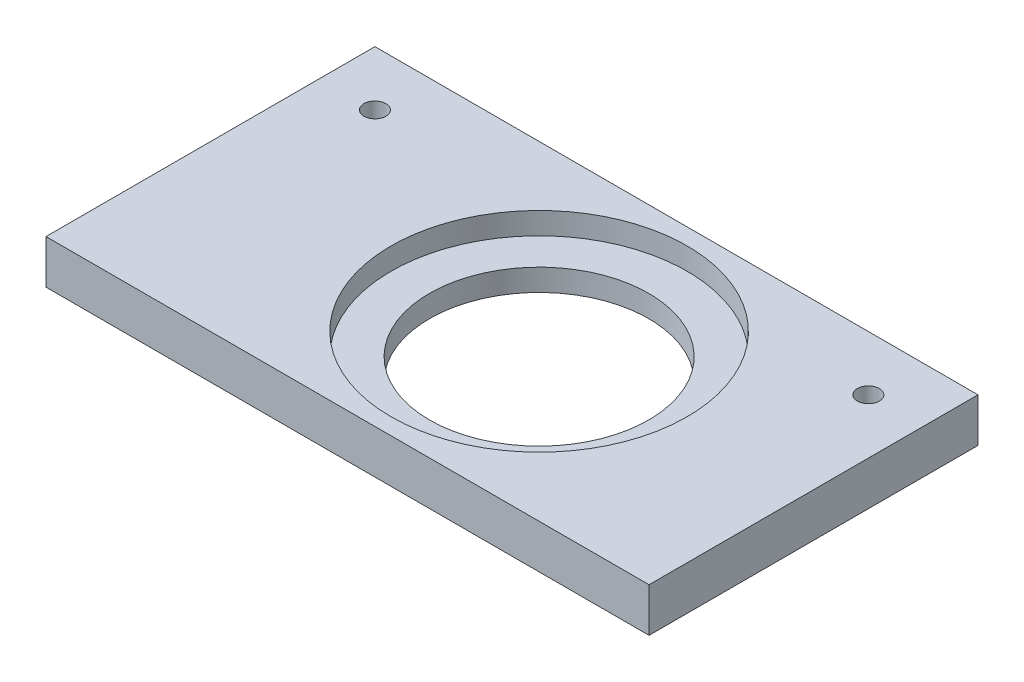
ISO-10303-21;
HEADER;
FILE_DESCRIPTION(('STEP AP214'),'2;1');
FILE_NAME('part.step','',(''),(''),'','','');
FILE_SCHEMA(('AUTOMOTIVE_DESIGN { 1 0 10303 214 1 1 1 1 }'));
ENDSEC;
DATA;
#1=APPLICATION_CONTEXT('core data for automotive mechanical design processes');
#2=APPLICATION_PROTOCOL_DEFINITION('international standard','automotive_design',2000,#1);
#3=PRODUCT_CONTEXT('',#1,'mechanical');
#4=PRODUCT('Part','Part','',(#3));
#5=PRODUCT_RELATED_PRODUCT_CATEGORY('part','',(#4));
#6=PRODUCT_DEFINITION_FORMATION('','',#4);
#7=PRODUCT_DEFINITION_CONTEXT('part definition',#1,'design');
#8=PRODUCT_DEFINITION('design','',#6,#7);
#9=PRODUCT_DEFINITION_SHAPE('','',#8);
#10=(LENGTH_UNIT() NAMED_UNIT(*) SI_UNIT(.MILLI.,.METRE.));
#11=(NAMED_UNIT(*) PLANE_ANGLE_UNIT() SI_UNIT($,.RADIAN.));
#12=(NAMED_UNIT(*) SI_UNIT($,.STERADIAN.) SOLID_ANGLE_UNIT());
#13=UNCERTAINTY_MEASURE_WITH_UNIT(LENGTH_MEASURE(1.E-05),#10,'distance_accuracy_value','');
#14=(GEOMETRIC_REPRESENTATION_CONTEXT(3) GLOBAL_UNCERTAINTY_ASSIGNED_CONTEXT((#13)) GLOBAL_UNIT_ASSIGNED_CONTEXT((#10,
#11,#12)) REPRESENTATION_CONTEXT('',''));
#15=CARTESIAN_POINT('',(0.,0.,0.));
#16=DIRECTION('',(0.,0.,1.));
#17=DIRECTION('',(1.,0.,0.));
#18=AXIS2_PLACEMENT_3D('',#15,#16,#17);
#19=CARTESIAN_POINT('',(0.,0.,0.));
#20=DIRECTION('',(0.,1.,0.));
#21=DIRECTION('',(0.,0.,1.));
#22=AXIS2_PLACEMENT_3D('',#19,#20,#21);
#23=CYLINDRICAL_SURFACE('',#22,50.);
#24=CARTESIAN_POINT('',(0.,0.,0.));
#25=DIRECTION('',(0.,1.,0.));
#26=DIRECTION('',(0.,0.,1.));
#27=AXIS2_PLACEMENT_3D('',#24,#25,#26);
#28=CIRCLE('',#27,50.);
#29=CARTESIAN_POINT('',(0.,0.,50.));
#30=VERTEX_POINT('',#29);
#31=EDGE_CURVE('E247',#30,#30,#28,.T.);
#32=ORIENTED_EDGE('',*,*,#31,.F.);
#33=EDGE_LOOP('',(#32));
#34=FACE_BOUND('',#33,.T.);
#35=CARTESIAN_POINT('',(0.,10.,0.));
#36=DIRECTION('',(0.,1.,0.));
#37=DIRECTION('',(0.,0.,1.));
#38=AXIS2_PLACEMENT_3D('',#35,#36,#37);
#39=CIRCLE('',#38,50.);
#40=CARTESIAN_POINT('',(0.,10.,50.));
#41=VERTEX_POINT('',#40);
#42=EDGE_CURVE('E46',#41,#41,#39,.F.);
#43=ORIENTED_EDGE('',*,*,#42,.F.);
#44=EDGE_LOOP('',(#43));
#45=FACE_BOUND('',#44,.T.);
#46=ADVANCED_FACE('F42',(#34,#45),#23,.F.);
#47=CARTESIAN_POINT('',(0.,20.,0.));
#48=DIRECTION('',(0.,-1.,0.));
#49=DIRECTION('',(0.,0.,-1.));
#50=AXIS2_PLACEMENT_3D('',#47,#48,#49);
#51=PLANE('',#50);
#52=CARTESIAN_POINT('',(100.14,20.,-50.));
#53=DIRECTION('',(0.,1.,0.));
#54=DIRECTION('',(0.,0.,1.));
#55=AXIS2_PLACEMENT_3D('',#52,#53,#54);
#56=CIRCLE('',#55,4.99999999999999);
#57=CARTESIAN_POINT('',(100.14,20.,-45.));
#58=VERTEX_POINT('',#57);
#59=EDGE_CURVE('E234',#58,#58,#56,.T.);
#60=ORIENTED_EDGE('',*,*,#59,.F.);
#61=EDGE_LOOP('',(#60));
#62=FACE_BOUND('',#61,.T.);
#63=CARTESIAN_POINT('',(-124.86,20.,-50.));
#64=DIRECTION('',(0.,1.,0.));
#65=DIRECTION('',(0.,0.,-1.));
#66=AXIS2_PLACEMENT_3D('',#63,#64,#65);
#67=CIRCLE('',#66,5.00000000000002);
#68=CARTESIAN_POINT('',(-124.86,20.,-55.));
#69=VERTEX_POINT('',#68);
#70=EDGE_CURVE('E200',#69,#69,#67,.T.);
#71=ORIENTED_EDGE('',*,*,#70,.F.);
#72=EDGE_LOOP('',(#71));
#73=FACE_BOUND('',#72,.T.);
#74=CARTESIAN_POINT('',(0.,20.,0.));
#75=DIRECTION('',(0.,1.,0.));
#76=DIRECTION('',(0.,0.,1.));
#77=AXIS2_PLACEMENT_3D('',#74,#75,#76);
#78=CIRCLE('',#77,67.5);
#79=CARTESIAN_POINT('',(0.,20.,67.5));
#80=VERTEX_POINT('',#79);
#81=EDGE_CURVE('E233',#80,#80,#78,.T.);
#82=ORIENTED_EDGE('',*,*,#81,.F.);
#83=EDGE_LOOP('',(#82));
#84=FACE_BOUND('',#83,.T.);
#85=DIRECTION('',(0.,0.,-1.));
#86=VECTOR('',#85,1.);
#87=CARTESIAN_POINT('',(125.14,20.,75.));
#88=LINE('',#87,#86);
#89=CARTESIAN_POINT('',(125.14,20.,75.));
#90=VERTEX_POINT('',#89);
#91=CARTESIAN_POINT('',(125.14,20.,-75.));
#92=VERTEX_POINT('',#91);
#93=EDGE_CURVE('E251',#90,#92,#88,.T.);
#94=ORIENTED_EDGE('',*,*,#93,.T.);
#95=DIRECTION('',(-1.,0.,0.));
#96=VECTOR('',#95,1.);
#97=CARTESIAN_POINT('',(-149.86,20.,-75.));
#98=LINE('',#97,#96);
#99=CARTESIAN_POINT('',(-149.86,20.,-75.));
#100=VERTEX_POINT('',#99);
#101=EDGE_CURVE('E254',#92,#100,#98,.T.);
#102=ORIENTED_EDGE('',*,*,#101,.T.);
#103=DIRECTION('',(0.,0.,1.));
#104=VECTOR('',#103,1.);
#105=CARTESIAN_POINT('',(-149.86,20.,75.));
#106=LINE('',#105,#104);
#107=CARTESIAN_POINT('',(-149.86,20.,75.));
#108=VERTEX_POINT('',#107);
#109=EDGE_CURVE('E257',#100,#108,#106,.T.);
#110=ORIENTED_EDGE('',*,*,#109,.T.);
#111=DIRECTION('',(1.,0.,0.));
#112=VECTOR('',#111,1.);
#113=CARTESIAN_POINT('',(-149.86,20.,75.));
#114=LINE('',#113,#112);
#115=EDGE_CURVE('E259',#108,#90,#114,.T.);
#116=ORIENTED_EDGE('',*,*,#115,.T.);
#117=EDGE_LOOP('',(#94,#102,#110,#116));
#118=FACE_BOUND('',#117,.T.);
#119=ADVANCED_FACE('F300',(#62,#73,#84,#118),#51,.F.);
#120=CARTESIAN_POINT('',(0.,0.,0.));
#121=DIRECTION('',(0.,-1.,0.));
#122=DIRECTION('',(0.,0.,-1.));
#123=AXIS2_PLACEMENT_3D('',#120,#121,#122);
#124=PLANE('',#123);
#125=DIRECTION('',(0.,0.,-1.));
#126=VECTOR('',#125,1.);
#127=CARTESIAN_POINT('',(-99.86,0.,-75.));
#128=LINE('',#127,#126);
#129=CARTESIAN_POINT('',(-99.86,0.,-68.52));
#130=VERTEX_POINT('',#129);
#131=CARTESIAN_POINT('',(-99.86,0.,-75.));
#132=VERTEX_POINT('',#131);
#133=EDGE_CURVE('E190',#130,#132,#128,.T.);
#134=ORIENTED_EDGE('',*,*,#133,.F.);
#135=DIRECTION('',(-1.,0.,0.));
#136=VECTOR('',#135,1.);
#137=CARTESIAN_POINT('',(-99.86,0.,-68.52));
#138=LINE('',#137,#136);
#139=CARTESIAN_POINT('',(-80.81,0.,-68.52));
#140=VERTEX_POINT('',#139);
#141=EDGE_CURVE('E182',#140,#130,#138,.T.);
#142=ORIENTED_EDGE('',*,*,#141,.F.);
#143=DIRECTION('',(0.,0.,1.));
#144=VECTOR('',#143,1.);
#145=CARTESIAN_POINT('',(-80.81,0.,-75.));
#146=LINE('',#145,#144);
#147=CARTESIAN_POINT('',(-80.81,0.,-75.));
#148=VERTEX_POINT('',#147);
#149=EDGE_CURVE('E192',#148,#140,#146,.T.);
#150=ORIENTED_EDGE('',*,*,#149,.F.);
#151=DIRECTION('',(-1.,0.,0.));
#152=VECTOR('',#151,1.);
#153=CARTESIAN_POINT('',(-149.86,0.,-75.));
#154=LINE('',#153,#152);
#155=CARTESIAN_POINT('',(56.09,0.,-75.));
#156=VERTEX_POINT('',#155);
#157=EDGE_CURVE('E269',#156,#148,#154,.T.);
#158=ORIENTED_EDGE('',*,*,#157,.F.);
#159=DIRECTION('',(0.,0.,-1.));
#160=VECTOR('',#159,1.);
#161=CARTESIAN_POINT('',(56.09,0.,-75.));
#162=LINE('',#161,#160);
#163=CARTESIAN_POINT('',(56.09,0.,-68.52));
#164=VERTEX_POINT('',#163);
#165=EDGE_CURVE('E193',#164,#156,#162,.T.);
#166=ORIENTED_EDGE('',*,*,#165,.F.);
#167=DIRECTION('',(-1.,0.,0.));
#168=VECTOR('',#167,1.);
#169=CARTESIAN_POINT('',(56.09,0.,-68.52));
#170=LINE('',#169,#168);
#171=CARTESIAN_POINT('',(75.14,0.,-68.52));
#172=VERTEX_POINT('',#171);
#173=EDGE_CURVE('E216',#172,#164,#170,.T.);
#174=ORIENTED_EDGE('',*,*,#173,.F.);
#175=DIRECTION('',(0.,0.,1.));
#176=VECTOR('',#175,1.);
#177=CARTESIAN_POINT('',(75.14,0.,-75.));
#178=LINE('',#177,#176);
#179=CARTESIAN_POINT('',(75.14,0.,-75.));
#180=VERTEX_POINT('',#179);
#181=EDGE_CURVE('E219',#180,#172,#178,.T.);
#182=ORIENTED_EDGE('',*,*,#181,.F.);
#183=CARTESIAN_POINT('',(125.14,0.,-75.));
#184=VERTEX_POINT('',#183);
#185=EDGE_CURVE('E265',#184,#180,#154,.T.);
#186=ORIENTED_EDGE('',*,*,#185,.F.);
#187=DIRECTION('',(0.,0.,-1.));
#188=VECTOR('',#187,1.);
#189=CARTESIAN_POINT('',(125.14,0.,75.));
#190=LINE('',#189,#188);
#191=CARTESIAN_POINT('',(125.14,0.,75.));
#192=VERTEX_POINT('',#191);
#193=EDGE_CURVE('E250',#192,#184,#190,.T.);
#194=ORIENTED_EDGE('',*,*,#193,.F.);
#195=DIRECTION('',(1.,0.,0.));
#196=VECTOR('',#195,1.);
#197=CARTESIAN_POINT('',(-149.86,0.,75.));
#198=LINE('',#197,#196);
#199=CARTESIAN_POINT('',(-149.86,0.,75.));
#200=VERTEX_POINT('',#199);
#201=EDGE_CURVE('E255',#200,#192,#198,.T.);
#202=ORIENTED_EDGE('',*,*,#201,.F.);
#203=DIRECTION('',(0.,0.,1.));
#204=VECTOR('',#203,1.);
#205=CARTESIAN_POINT('',(-149.86,0.,75.));
#206=LINE('',#205,#204);
#207=CARTESIAN_POINT('',(-149.86,0.,-75.));
#208=VERTEX_POINT('',#207);
#209=EDGE_CURVE('E268',#208,#200,#206,.T.);
#210=ORIENTED_EDGE('',*,*,#209,.F.);
#211=EDGE_CURVE('E264',#132,#208,#154,.T.);
#212=ORIENTED_EDGE('',*,*,#211,.F.);
#213=EDGE_LOOP('',(#134,#142,#150,#158,#166,#174,#182,#186,#194,#202,#210,#212));
#214=FACE_BOUND('',#213,.T.);
#215=CARTESIAN_POINT('',(100.14,0.,-50.));
#216=DIRECTION('',(0.,1.,0.));
#217=DIRECTION('',(0.,0.,1.));
#218=AXIS2_PLACEMENT_3D('',#215,#216,#217);
#219=CIRCLE('',#218,4.99999999999999);
#220=CARTESIAN_POINT('',(100.14,0.,-45.));
#221=VERTEX_POINT('',#220);
#222=EDGE_CURVE('E230',#221,#221,#219,.T.);
#223=ORIENTED_EDGE('',*,*,#222,.T.);
#224=EDGE_LOOP('',(#223));
#225=FACE_BOUND('',#224,.T.);
#226=CARTESIAN_POINT('',(-124.86,0.,-50.));
#227=DIRECTION('',(0.,1.,0.));
#228=DIRECTION('',(0.,0.,-1.));
#229=AXIS2_PLACEMENT_3D('',#226,#227,#228);
#230=CIRCLE('',#229,5.00000000000002);
#231=CARTESIAN_POINT('',(-124.86,0.,-55.));
#232=VERTEX_POINT('',#231);
#233=EDGE_CURVE('E237',#232,#232,#230,.T.);
#234=ORIENTED_EDGE('',*,*,#233,.T.);
#235=EDGE_LOOP('',(#234));
#236=FACE_BOUND('',#235,.T.);
#237=ORIENTED_EDGE('',*,*,#31,.T.);
#238=EDGE_LOOP('',(#237));
#239=FACE_BOUND('',#238,.T.);
#240=ADVANCED_FACE('F289',(#214,#225,#236,#239),#124,.T.);
#241=CARTESIAN_POINT('',(125.14,20.,75.));
#242=DIRECTION('',(-1.,0.,0.));
#243=DIRECTION('',(0.,0.,1.));
#244=AXIS2_PLACEMENT_3D('',#241,#242,#243);
#245=PLANE('',#244);
#246=ORIENTED_EDGE('',*,*,#193,.T.);
#247=DIRECTION('',(0.,-1.,0.));
#248=VECTOR('',#247,1.);
#249=CARTESIAN_POINT('',(125.14,20.,-75.));
#250=LINE('',#249,#248);
#251=EDGE_CURVE('E11',#92,#184,#250,.T.);
#252=ORIENTED_EDGE('',*,*,#251,.F.);
#253=ORIENTED_EDGE('',*,*,#93,.F.);
#254=DIRECTION('',(0.,-1.,0.));
#255=VECTOR('',#254,1.);
#256=CARTESIAN_POINT('',(125.14,20.,75.));
#257=LINE('',#256,#255);
#258=EDGE_CURVE('E261',#90,#192,#257,.T.);
#259=ORIENTED_EDGE('',*,*,#258,.T.);
#260=EDGE_LOOP('',(#246,#252,#253,#259));
#261=FACE_BOUND('',#260,.T.);
#262=ADVANCED_FACE('F44',(#261),#245,.F.);
#263=CARTESIAN_POINT('',(-149.86,20.,-75.));
#264=DIRECTION('',(0.,0.,1.));
#265=DIRECTION('',(1.,0.,0.));
#266=AXIS2_PLACEMENT_3D('',#263,#264,#265);
#267=PLANE('',#266);
#268=DIRECTION('',(1.,0.,0.));
#269=VECTOR('',#268,1.);
#270=CARTESIAN_POINT('',(-99.86,0.64,-75.));
#271=LINE('',#270,#269);
#272=CARTESIAN_POINT('',(-99.86,0.640000000000002,-75.));
#273=VERTEX_POINT('',#272);
#274=CARTESIAN_POINT('',(-80.81,0.64,-75.));
#275=VERTEX_POINT('',#274);
#276=EDGE_CURVE('E181',#273,#275,#271,.T.);
#277=ORIENTED_EDGE('',*,*,#276,.F.);
#278=DIRECTION('',(0.,-1.,0.));
#279=VECTOR('',#278,1.);
#280=CARTESIAN_POINT('',(-99.86,0.64,-75.));
#281=LINE('',#280,#279);
#282=EDGE_CURVE('E189',#273,#132,#281,.T.);
#283=ORIENTED_EDGE('',*,*,#282,.T.);
#284=ORIENTED_EDGE('',*,*,#211,.T.);
#285=DIRECTION('',(0.,-1.,0.));
#286=VECTOR('',#285,1.);
#287=CARTESIAN_POINT('',(-149.86,20.,-75.));
#288=LINE('',#287,#286);
#289=EDGE_CURVE('E51',#100,#208,#288,.T.);
#290=ORIENTED_EDGE('',*,*,#289,.F.);
#291=ORIENTED_EDGE('',*,*,#101,.F.);
#292=ORIENTED_EDGE('',*,*,#251,.T.);
#293=ORIENTED_EDGE('',*,*,#185,.T.);
#294=DIRECTION('',(0.,-1.,0.));
#295=VECTOR('',#294,1.);
#296=CARTESIAN_POINT('',(75.14,0.64,-75.));
#297=LINE('',#296,#295);
#298=CARTESIAN_POINT('',(75.14,0.64,-75.));
#299=VERTEX_POINT('',#298);
#300=EDGE_CURVE('E211',#299,#180,#297,.T.);
#301=ORIENTED_EDGE('',*,*,#300,.F.);
#302=DIRECTION('',(1.,0.,0.));
#303=VECTOR('',#302,1.);
#304=CARTESIAN_POINT('',(56.09,0.64,-75.));
#305=LINE('',#304,#303);
#306=CARTESIAN_POINT('',(56.09,0.640000000000002,-75.));
#307=VERTEX_POINT('',#306);
#308=EDGE_CURVE('E227',#307,#299,#305,.T.);
#309=ORIENTED_EDGE('',*,*,#308,.F.);
#310=DIRECTION('',(0.,-1.,0.));
#311=VECTOR('',#310,1.);
#312=CARTESIAN_POINT('',(56.09,0.64,-75.));
#313=LINE('',#312,#311);
#314=EDGE_CURVE('E207',#307,#156,#313,.T.);
#315=ORIENTED_EDGE('',*,*,#314,.T.);
#316=ORIENTED_EDGE('',*,*,#157,.T.);
#317=DIRECTION('',(0.,-1.,0.));
#318=VECTOR('',#317,1.);
#319=CARTESIAN_POINT('',(-80.81,0.64,-75.));
#320=LINE('',#319,#318);
#321=EDGE_CURVE('E203',#275,#148,#320,.T.);
#322=ORIENTED_EDGE('',*,*,#321,.F.);
#323=EDGE_LOOP('',(#277,#283,#284,#290,#291,#292,#293,#301,#309,#315,#316,#322));
#324=FACE_BOUND('',#323,.T.);
#325=ADVANCED_FACE('F302',(#324),#267,.F.);
#326=CARTESIAN_POINT('',(-149.86,20.,75.));
#327=DIRECTION('',(1.,0.,0.));
#328=DIRECTION('',(0.,0.,-1.));
#329=AXIS2_PLACEMENT_3D('',#326,#327,#328);
#330=PLANE('',#329);
#331=ORIENTED_EDGE('',*,*,#209,.T.);
#332=DIRECTION('',(0.,-1.,0.));
#333=VECTOR('',#332,1.);
#334=CARTESIAN_POINT('',(-149.86,20.,75.));
#335=LINE('',#334,#333);
#336=EDGE_CURVE('E274',#108,#200,#335,.T.);
#337=ORIENTED_EDGE('',*,*,#336,.F.);
#338=ORIENTED_EDGE('',*,*,#109,.F.);
#339=ORIENTED_EDGE('',*,*,#289,.T.);
#340=EDGE_LOOP('',(#331,#337,#338,#339));
#341=FACE_BOUND('',#340,.T.);
#342=ADVANCED_FACE('F282',(#341),#330,.F.);
#343=CARTESIAN_POINT('',(-149.86,20.,75.));
#344=DIRECTION('',(0.,0.,-1.));
#345=DIRECTION('',(-1.,0.,0.));
#346=AXIS2_PLACEMENT_3D('',#343,#344,#345);
#347=PLANE('',#346);
#348=ORIENTED_EDGE('',*,*,#201,.T.);
#349=ORIENTED_EDGE('',*,*,#258,.F.);
#350=ORIENTED_EDGE('',*,*,#115,.F.);
#351=ORIENTED_EDGE('',*,*,#336,.T.);
#352=EDGE_LOOP('',(#348,#349,#350,#351));
#353=FACE_BOUND('',#352,.T.);
#354=ADVANCED_FACE('F294',(#353),#347,.F.);
#355=CARTESIAN_POINT('',(0.,10.,0.));
#356=DIRECTION('',(0.,1.,0.));
#357=DIRECTION('',(0.,0.,1.));
#358=AXIS2_PLACEMENT_3D('',#355,#356,#357);
#359=PLANE('',#358);
#360=CARTESIAN_POINT('',(0.,10.,0.));
#361=DIRECTION('',(0.,1.,0.));
#362=DIRECTION('',(0.,0.,1.));
#363=AXIS2_PLACEMENT_3D('',#360,#361,#362);
#364=CIRCLE('',#363,67.5);
#365=CARTESIAN_POINT('',(0.,10.,67.5));
#366=VERTEX_POINT('',#365);
#367=EDGE_CURVE('E242',#366,#366,#364,.T.);
#368=ORIENTED_EDGE('',*,*,#367,.T.);
#369=EDGE_LOOP('',(#368));
#370=FACE_BOUND('',#369,.T.);
#371=ORIENTED_EDGE('',*,*,#42,.T.);
#372=EDGE_LOOP('',(#371));
#373=FACE_BOUND('',#372,.T.);
#374=ADVANCED_FACE('F359',(#370,#373),#359,.T.);
#375=CARTESIAN_POINT('',(0.,10.,0.));
#376=DIRECTION('',(0.,1.,0.));
#377=DIRECTION('',(0.,0.,1.));
#378=AXIS2_PLACEMENT_3D('',#375,#376,#377);
#379=CYLINDRICAL_SURFACE('',#378,67.5);
#380=ORIENTED_EDGE('',*,*,#367,.F.);
#381=EDGE_LOOP('',(#380));
#382=FACE_BOUND('',#381,.T.);
#383=ORIENTED_EDGE('',*,*,#81,.T.);
#384=EDGE_LOOP('',(#383));
#385=FACE_BOUND('',#384,.T.);
#386=ADVANCED_FACE('F352',(#382,#385),#379,.F.);
#387=CARTESIAN_POINT('',(-124.86,0.,-50.));
#388=DIRECTION('',(0.,1.,0.));
#389=DIRECTION('',(0.,0.,1.));
#390=AXIS2_PLACEMENT_3D('',#387,#388,#389);
#391=CYLINDRICAL_SURFACE('',#390,5.00000000000002);
#392=ORIENTED_EDGE('',*,*,#233,.F.);
#393=EDGE_LOOP('',(#392));
#394=FACE_BOUND('',#393,.T.);
#395=ORIENTED_EDGE('',*,*,#70,.T.);
#396=EDGE_LOOP('',(#395));
#397=FACE_BOUND('',#396,.T.);
#398=ADVANCED_FACE('F396',(#394,#397),#391,.F.);
#399=CARTESIAN_POINT('',(100.14,0.,-50.));
#400=DIRECTION('',(0.,1.,0.));
#401=DIRECTION('',(0.,0.,1.));
#402=AXIS2_PLACEMENT_3D('',#399,#400,#401);
#403=CYLINDRICAL_SURFACE('',#402,4.99999999999999);
#404=ORIENTED_EDGE('',*,*,#222,.F.);
#405=EDGE_LOOP('',(#404));
#406=FACE_BOUND('',#405,.T.);
#407=ORIENTED_EDGE('',*,*,#59,.T.);
#408=EDGE_LOOP('',(#407));
#409=FACE_BOUND('',#408,.T.);
#410=ADVANCED_FACE('F404',(#406,#409),#403,.F.);
#411=CARTESIAN_POINT('',(56.09,0.64,-75.));
#412=DIRECTION('',(-1.,0.,0.));
#413=DIRECTION('',(0.,0.,1.));
#414=AXIS2_PLACEMENT_3D('',#411,#412,#413);
#415=PLANE('',#414);
#416=ORIENTED_EDGE('',*,*,#165,.T.);
#417=ORIENTED_EDGE('',*,*,#314,.F.);
#418=DIRECTION('',(0.,0.,-1.));
#419=VECTOR('',#418,1.);
#420=CARTESIAN_POINT('',(56.09,0.64,-75.));
#421=LINE('',#420,#419);
#422=CARTESIAN_POINT('',(56.09,0.64,-68.52));
#423=VERTEX_POINT('',#422);
#424=EDGE_CURVE('E66',#423,#307,#421,.T.);
#425=ORIENTED_EDGE('',*,*,#424,.F.);
#426=DIRECTION('',(0.,-1.,0.));
#427=VECTOR('',#426,1.);
#428=CARTESIAN_POINT('',(56.09,0.64,-68.52));
#429=LINE('',#428,#427);
#430=EDGE_CURVE('E179',#423,#164,#429,.T.);
#431=ORIENTED_EDGE('',*,*,#430,.T.);
#432=EDGE_LOOP('',(#416,#417,#425,#431));
#433=FACE_BOUND('',#432,.T.);
#434=ADVANCED_FACE('F412',(#433),#415,.F.);
#435=CARTESIAN_POINT('',(56.09,0.64,-68.52));
#436=DIRECTION('',(0.,0.,1.));
#437=DIRECTION('',(1.,0.,0.));
#438=AXIS2_PLACEMENT_3D('',#435,#436,#437);
#439=PLANE('',#438);
#440=ORIENTED_EDGE('',*,*,#173,.T.);
#441=ORIENTED_EDGE('',*,*,#430,.F.);
#442=DIRECTION('',(-1.,0.,0.));
#443=VECTOR('',#442,1.);
#444=CARTESIAN_POINT('',(56.09,0.64,-68.52));
#445=LINE('',#444,#443);
#446=CARTESIAN_POINT('',(75.14,0.64,-68.52));
#447=VERTEX_POINT('',#446);
#448=EDGE_CURVE('E210',#447,#423,#445,.T.);
#449=ORIENTED_EDGE('',*,*,#448,.F.);
#450=DIRECTION('',(0.,-1.,0.));
#451=VECTOR('',#450,1.);
#452=CARTESIAN_POINT('',(75.14,0.64,-68.52));
#453=LINE('',#452,#451);
#454=EDGE_CURVE('E213',#447,#172,#453,.T.);
#455=ORIENTED_EDGE('',*,*,#454,.T.);
#456=EDGE_LOOP('',(#440,#441,#449,#455));
#457=FACE_BOUND('',#456,.T.);
#458=ADVANCED_FACE('F419',(#457),#439,.F.);
#459=CARTESIAN_POINT('',(75.14,0.64,-75.));
#460=DIRECTION('',(1.,0.,0.));
#461=DIRECTION('',(0.,0.,-1.));
#462=AXIS2_PLACEMENT_3D('',#459,#460,#461);
#463=PLANE('',#462);
#464=ORIENTED_EDGE('',*,*,#181,.T.);
#465=ORIENTED_EDGE('',*,*,#454,.F.);
#466=DIRECTION('',(0.,0.,1.));
#467=VECTOR('',#466,1.);
#468=CARTESIAN_POINT('',(75.14,0.64,-75.));
#469=LINE('',#468,#467);
#470=EDGE_CURVE('E224',#299,#447,#469,.T.);
#471=ORIENTED_EDGE('',*,*,#470,.F.);
#472=ORIENTED_EDGE('',*,*,#300,.T.);
#473=EDGE_LOOP('',(#464,#465,#471,#472));
#474=FACE_BOUND('',#473,.T.);
#475=ADVANCED_FACE('F309',(#474),#463,.F.);
#476=CARTESIAN_POINT('',(0.,0.64,0.));
#477=DIRECTION('',(0.,1.,0.));
#478=DIRECTION('',(0.,0.,1.));
#479=AXIS2_PLACEMENT_3D('',#476,#477,#478);
#480=PLANE('',#479);
#481=CARTESIAN_POINT('',(71.18,0.639999999999999,-71.76));
#482=DIRECTION('',(0.,-1.,0.));
#483=DIRECTION('',(0.,0.,-1.));
#484=AXIS2_PLACEMENT_3D('',#481,#482,#483);
#485=CIRCLE('',#484,1.3);
#486=CARTESIAN_POINT('',(71.18,0.639999999999999,-73.06));
#487=VERTEX_POINT('',#486);
#488=EDGE_CURVE('E167',#487,#487,#485,.T.);
#489=ORIENTED_EDGE('',*,*,#488,.F.);
#490=EDGE_LOOP('',(#489));
#491=FACE_BOUND('',#490,.T.);
#492=CARTESIAN_POINT('',(60.2096162601313,0.639999999999999,-71.76));
#493=DIRECTION('',(0.,-1.,0.));
#494=DIRECTION('',(0.,0.,-1.));
#495=AXIS2_PLACEMENT_3D('',#492,#493,#494);
#496=CIRCLE('',#495,1.29999999999999);
#497=CARTESIAN_POINT('',(60.2096162601313,0.639999999999999,-73.06));
#498=VERTEX_POINT('',#497);
#499=EDGE_CURVE('E173',#498,#498,#496,.T.);
#500=ORIENTED_EDGE('',*,*,#499,.F.);
#501=EDGE_LOOP('',(#500));
#502=FACE_BOUND('',#501,.T.);
#503=ORIENTED_EDGE('',*,*,#424,.T.);
#504=ORIENTED_EDGE('',*,*,#308,.T.);
#505=ORIENTED_EDGE('',*,*,#470,.T.);
#506=ORIENTED_EDGE('',*,*,#448,.T.);
#507=EDGE_LOOP('',(#503,#504,#505,#506));
#508=FACE_BOUND('',#507,.T.);
#509=ADVANCED_FACE('F311',(#491,#502,#508),#480,.F.);
#510=CARTESIAN_POINT('',(-99.86,0.64,-75.));
#511=DIRECTION('',(-1.,0.,0.));
#512=DIRECTION('',(0.,0.,1.));
#513=AXIS2_PLACEMENT_3D('',#510,#511,#512);
#514=PLANE('',#513);
#515=ORIENTED_EDGE('',*,*,#133,.T.);
#516=ORIENTED_EDGE('',*,*,#282,.F.);
#517=DIRECTION('',(0.,0.,-1.));
#518=VECTOR('',#517,1.);
#519=CARTESIAN_POINT('',(-99.86,0.64,-75.));
#520=LINE('',#519,#518);
#521=CARTESIAN_POINT('',(-99.86,0.64,-68.52));
#522=VERTEX_POINT('',#521);
#523=EDGE_CURVE('E58',#522,#273,#520,.T.);
#524=ORIENTED_EDGE('',*,*,#523,.F.);
#525=DIRECTION('',(0.,-1.,0.));
#526=VECTOR('',#525,1.);
#527=CARTESIAN_POINT('',(-99.86,0.64,-68.52));
#528=LINE('',#527,#526);
#529=EDGE_CURVE('E198',#522,#130,#528,.T.);
#530=ORIENTED_EDGE('',*,*,#529,.T.);
#531=EDGE_LOOP('',(#515,#516,#524,#530));
#532=FACE_BOUND('',#531,.T.);
#533=ADVANCED_FACE('F319',(#532),#514,.F.);
#534=CARTESIAN_POINT('',(-99.86,0.64,-68.52));
#535=DIRECTION('',(0.,0.,1.));
#536=DIRECTION('',(1.,0.,0.));
#537=AXIS2_PLACEMENT_3D('',#534,#535,#536);
#538=PLANE('',#537);
#539=ORIENTED_EDGE('',*,*,#141,.T.);
#540=ORIENTED_EDGE('',*,*,#529,.F.);
#541=DIRECTION('',(-1.,0.,0.));
#542=VECTOR('',#541,1.);
#543=CARTESIAN_POINT('',(-99.86,0.64,-68.52));
#544=LINE('',#543,#542);
#545=CARTESIAN_POINT('',(-80.81,0.64,-68.52));
#546=VERTEX_POINT('',#545);
#547=EDGE_CURVE('E187',#546,#522,#544,.T.);
#548=ORIENTED_EDGE('',*,*,#547,.F.);
#549=DIRECTION('',(0.,-1.,0.));
#550=VECTOR('',#549,1.);
#551=CARTESIAN_POINT('',(-80.81,0.64,-68.52));
#552=LINE('',#551,#550);
#553=EDGE_CURVE('E201',#546,#140,#552,.T.);
#554=ORIENTED_EDGE('',*,*,#553,.T.);
#555=EDGE_LOOP('',(#539,#540,#548,#554));
#556=FACE_BOUND('',#555,.T.);
#557=ADVANCED_FACE('F321',(#556),#538,.F.);
#558=CARTESIAN_POINT('',(-80.81,0.64,-75.));
#559=DIRECTION('',(1.,0.,0.));
#560=DIRECTION('',(0.,0.,-1.));
#561=AXIS2_PLACEMENT_3D('',#558,#559,#560);
#562=PLANE('',#561);
#563=ORIENTED_EDGE('',*,*,#149,.T.);
#564=ORIENTED_EDGE('',*,*,#553,.F.);
#565=DIRECTION('',(0.,0.,1.));
#566=VECTOR('',#565,1.);
#567=CARTESIAN_POINT('',(-80.81,0.64,-75.));
#568=LINE('',#567,#566);
#569=EDGE_CURVE('E184',#275,#546,#568,.T.);
#570=ORIENTED_EDGE('',*,*,#569,.F.);
#571=ORIENTED_EDGE('',*,*,#321,.T.);
#572=EDGE_LOOP('',(#563,#564,#570,#571));
#573=FACE_BOUND('',#572,.T.);
#574=ADVANCED_FACE('F324',(#573),#562,.F.);
#575=CARTESIAN_POINT('',(0.,0.64,0.));
#576=DIRECTION('',(0.,1.,0.));
#577=DIRECTION('',(0.,0.,1.));
#578=AXIS2_PLACEMENT_3D('',#575,#576,#577);
#579=PLANE('',#578);
#580=CARTESIAN_POINT('',(-95.9,0.639999999999999,-71.76));
#581=DIRECTION('',(0.,-1.,0.));
#582=DIRECTION('',(0.,0.,-1.));
#583=AXIS2_PLACEMENT_3D('',#580,#581,#582);
#584=CIRCLE('',#583,1.3);
#585=CARTESIAN_POINT('',(-95.9,0.639999999999999,-73.06));
#586=VERTEX_POINT('',#585);
#587=EDGE_CURVE('E157',#586,#586,#584,.T.);
#588=ORIENTED_EDGE('',*,*,#587,.F.);
#589=EDGE_LOOP('',(#588));
#590=FACE_BOUND('',#589,.T.);
#591=CARTESIAN_POINT('',(-84.77,0.639999999999999,-71.76));
#592=DIRECTION('',(0.,-1.,0.));
#593=DIRECTION('',(0.,0.,-1.));
#594=AXIS2_PLACEMENT_3D('',#591,#592,#593);
#595=CIRCLE('',#594,1.3);
#596=CARTESIAN_POINT('',(-84.77,0.639999999999999,-73.06));
#597=VERTEX_POINT('',#596);
#598=EDGE_CURVE('E156',#597,#597,#595,.T.);
#599=ORIENTED_EDGE('',*,*,#598,.F.);
#600=EDGE_LOOP('',(#599));
#601=FACE_BOUND('',#600,.T.);
#602=ORIENTED_EDGE('',*,*,#523,.T.);
#603=ORIENTED_EDGE('',*,*,#276,.T.);
#604=ORIENTED_EDGE('',*,*,#569,.T.);
#605=ORIENTED_EDGE('',*,*,#547,.T.);
#606=EDGE_LOOP('',(#602,#603,#604,#605));
#607=FACE_BOUND('',#606,.T.);
#608=ADVANCED_FACE('F325',(#590,#601,#607),#579,.F.);
#609=CARTESIAN_POINT('',(60.2096162601313,2.64,-71.76));
#610=DIRECTION('',(0.,-1.,0.));
#611=DIRECTION('',(0.,0.,-1.));
#612=AXIS2_PLACEMENT_3D('',#609,#610,#611);
#613=CONICAL_SURFACE('',#612,1.29999999999999,1.02974425867665);
#614=CARTESIAN_POINT('',(60.2096162601313,3.42111880473583,-71.76));
#615=VERTEX_POINT('',#614);
#616=VERTEX_LOOP('',#615);
#617=FACE_BOUND('',#616,.T.);
#618=CARTESIAN_POINT('',(60.2096162601313,2.64,-71.76));
#619=DIRECTION('',(0.,-1.,0.));
#620=DIRECTION('',(0.,0.,-1.));
#621=AXIS2_PLACEMENT_3D('',#618,#619,#620);
#622=CIRCLE('',#621,1.29999999999999);
#623=CARTESIAN_POINT('',(60.2096162601313,2.64,-73.06));
#624=VERTEX_POINT('',#623);
#625=EDGE_CURVE('E176',#624,#624,#622,.T.);
#626=ORIENTED_EDGE('',*,*,#625,.T.);
#627=EDGE_LOOP('',(#626));
#628=FACE_BOUND('',#627,.T.);
#629=ADVANCED_FACE('F327',(#617,#628),#613,.F.);
#630=CARTESIAN_POINT('',(60.2096162601313,0.64,-71.76));
#631=DIRECTION('',(0.,-1.,0.));
#632=DIRECTION('',(0.,0.,-1.));
#633=AXIS2_PLACEMENT_3D('',#630,#631,#632);
#634=CYLINDRICAL_SURFACE('',#633,1.29999999999999);
#635=ORIENTED_EDGE('',*,*,#625,.F.);
#636=EDGE_LOOP('',(#635));
#637=FACE_BOUND('',#636,.T.);
#638=ORIENTED_EDGE('',*,*,#499,.T.);
#639=EDGE_LOOP('',(#638));
#640=FACE_BOUND('',#639,.T.);
#641=ADVANCED_FACE('F334',(#637,#640),#634,.F.);
#642=CARTESIAN_POINT('',(71.18,2.64,-71.76));
#643=DIRECTION('',(0.,-1.,0.));
#644=DIRECTION('',(0.,0.,-1.));
#645=AXIS2_PLACEMENT_3D('',#642,#643,#644);
#646=CONICAL_SURFACE('',#645,1.29999999999998,1.02974425867665);
#647=CARTESIAN_POINT('',(71.18,3.42111880473583,-71.76));
#648=VERTEX_POINT('',#647);
#649=VERTEX_LOOP('',#648);
#650=FACE_BOUND('',#649,.T.);
#651=CARTESIAN_POINT('',(71.18,2.64,-71.76));
#652=DIRECTION('',(0.,-1.,0.));
#653=DIRECTION('',(0.,0.,-1.));
#654=AXIS2_PLACEMENT_3D('',#651,#652,#653);
#655=CIRCLE('',#654,1.29999999999998);
#656=CARTESIAN_POINT('',(71.18,2.64,-73.06));
#657=VERTEX_POINT('',#656);
#658=EDGE_CURVE('E170',#657,#657,#655,.T.);
#659=ORIENTED_EDGE('',*,*,#658,.T.);
#660=EDGE_LOOP('',(#659));
#661=FACE_BOUND('',#660,.T.);
#662=ADVANCED_FACE('F484',(#650,#661),#646,.F.);
#663=CARTESIAN_POINT('',(71.18,0.64,-71.76));
#664=DIRECTION('',(0.,-1.,0.));
#665=DIRECTION('',(0.,0.,-1.));
#666=AXIS2_PLACEMENT_3D('',#663,#664,#665);
#667=CYLINDRICAL_SURFACE('',#666,1.29999999999999);
#668=ORIENTED_EDGE('',*,*,#658,.F.);
#669=EDGE_LOOP('',(#668));
#670=FACE_BOUND('',#669,.T.);
#671=ORIENTED_EDGE('',*,*,#488,.T.);
#672=EDGE_LOOP('',(#671));
#673=FACE_BOUND('',#672,.T.);
#674=ADVANCED_FACE('F495',(#670,#673),#667,.F.);
#675=CARTESIAN_POINT('',(-84.77,2.64,-71.76));
#676=DIRECTION('',(0.,-1.,0.));
#677=DIRECTION('',(0.,0.,-1.));
#678=AXIS2_PLACEMENT_3D('',#675,#676,#677);
#679=CONICAL_SURFACE('',#678,1.29999999999998,1.02974425867665);
#680=CARTESIAN_POINT('',(-84.77,3.42111880473583,-71.76));
#681=VERTEX_POINT('',#680);
#682=VERTEX_LOOP('',#681);
#683=FACE_BOUND('',#682,.T.);
#684=CARTESIAN_POINT('',(-84.77,2.64,-71.76));
#685=DIRECTION('',(0.,-1.,0.));
#686=DIRECTION('',(0.,0.,-1.));
#687=AXIS2_PLACEMENT_3D('',#684,#685,#686);
#688=CIRCLE('',#687,1.29999999999998);
#689=CARTESIAN_POINT('',(-84.77,2.64,-73.06));
#690=VERTEX_POINT('',#689);
#691=EDGE_CURVE('E160',#690,#690,#688,.T.);
#692=ORIENTED_EDGE('',*,*,#691,.T.);
#693=EDGE_LOOP('',(#692));
#694=FACE_BOUND('',#693,.T.);
#695=ADVANCED_FACE('F506',(#683,#694),#679,.F.);
#696=CARTESIAN_POINT('',(-84.77,0.64,-71.76));
#697=DIRECTION('',(0.,-1.,0.));
#698=DIRECTION('',(0.,0.,-1.));
#699=AXIS2_PLACEMENT_3D('',#696,#697,#698);
#700=CYLINDRICAL_SURFACE('',#699,1.29999999999999);
#701=ORIENTED_EDGE('',*,*,#691,.F.);
#702=EDGE_LOOP('',(#701));
#703=FACE_BOUND('',#702,.T.);
#704=ORIENTED_EDGE('',*,*,#598,.T.);
#705=EDGE_LOOP('',(#704));
#706=FACE_BOUND('',#705,.T.);
#707=ADVANCED_FACE('F150',(#703,#706),#700,.F.);
#708=CARTESIAN_POINT('',(-95.9,2.64,-71.76));
#709=DIRECTION('',(0.,-1.,0.));
#710=DIRECTION('',(0.,0.,-1.));
#711=AXIS2_PLACEMENT_3D('',#708,#709,#710);
#712=CONICAL_SURFACE('',#711,1.29999999999998,1.02974425867665);
#713=CARTESIAN_POINT('',(-95.9,3.42111880473583,-71.76));
#714=VERTEX_POINT('',#713);
#715=VERTEX_LOOP('',#714);
#716=FACE_BOUND('',#715,.T.);
#717=CARTESIAN_POINT('',(-95.9,2.64,-71.76));
#718=DIRECTION('',(0.,-1.,0.));
#719=DIRECTION('',(0.,0.,-1.));
#720=AXIS2_PLACEMENT_3D('',#717,#718,#719);
#721=CIRCLE('',#720,1.29999999999998);
#722=CARTESIAN_POINT('',(-95.9,2.64,-73.06));
#723=VERTEX_POINT('',#722);
#724=EDGE_CURVE('E154',#723,#723,#721,.T.);
#725=ORIENTED_EDGE('',*,*,#724,.T.);
#726=EDGE_LOOP('',(#725));
#727=FACE_BOUND('',#726,.T.);
#728=ADVANCED_FACE('F146',(#716,#727),#712,.F.);
#729=CARTESIAN_POINT('',(-95.9,0.64,-71.76));
#730=DIRECTION('',(0.,-1.,0.));
#731=DIRECTION('',(0.,0.,-1.));
#732=AXIS2_PLACEMENT_3D('',#729,#730,#731);
#733=CYLINDRICAL_SURFACE('',#732,1.29999999999999);
#734=ORIENTED_EDGE('',*,*,#724,.F.);
#735=EDGE_LOOP('',(#734));
#736=FACE_BOUND('',#735,.T.);
#737=ORIENTED_EDGE('',*,*,#587,.T.);
#738=EDGE_LOOP('',(#737));
#739=FACE_BOUND('',#738,.T.);
#740=ADVANCED_FACE('F149',(#736,#739),#733,.F.);
#741=CLOSED_SHELL('',(#46,#119,#240,#262,#325,#342,#354,#374,#386,#398,#410,#434,#458,#475,#509,
#533,#557,#574,#608,#629,#641,#662,#674,#695,#707,#728,#740));
#742=MANIFOLD_SOLID_BREP('B2',#741);
#743=ADVANCED_BREP_SHAPE_REPRESENTATION('',(#18,#742),#14);
#744=SHAPE_DEFINITION_REPRESENTATION(#9,#743);
ENDSEC;
END-ISO-10303-21;
